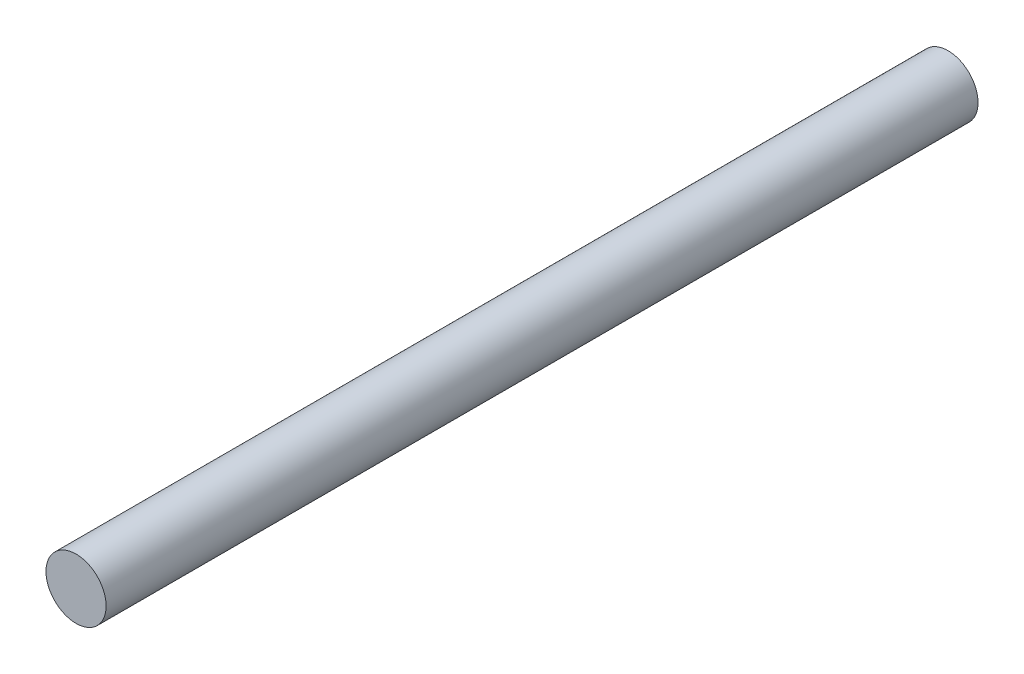
ISO-10303-21;
HEADER;
FILE_DESCRIPTION(('STEP AP214'),'2;1');
FILE_NAME('part.step','',(''),(''),'','','');
FILE_SCHEMA(('AUTOMOTIVE_DESIGN { 1 0 10303 214 1 1 1 1 }'));
ENDSEC;
DATA;
#1=APPLICATION_CONTEXT('core data for automotive mechanical design processes');
#2=APPLICATION_PROTOCOL_DEFINITION('international standard','automotive_design',2000,#1);
#3=PRODUCT_CONTEXT('',#1,'mechanical');
#4=PRODUCT('Part','Part','',(#3));
#5=PRODUCT_RELATED_PRODUCT_CATEGORY('part','',(#4));
#6=PRODUCT_DEFINITION_FORMATION('','',#4);
#7=PRODUCT_DEFINITION_CONTEXT('part definition',#1,'design');
#8=PRODUCT_DEFINITION('design','',#6,#7);
#9=PRODUCT_DEFINITION_SHAPE('','',#8);
#10=(LENGTH_UNIT() NAMED_UNIT(*) SI_UNIT(.MILLI.,.METRE.));
#11=(NAMED_UNIT(*) PLANE_ANGLE_UNIT() SI_UNIT($,.RADIAN.));
#12=(NAMED_UNIT(*) SI_UNIT($,.STERADIAN.) SOLID_ANGLE_UNIT());
#13=UNCERTAINTY_MEASURE_WITH_UNIT(LENGTH_MEASURE(1.E-05),#10,'distance_accuracy_value','');
#14=(GEOMETRIC_REPRESENTATION_CONTEXT(3) GLOBAL_UNCERTAINTY_ASSIGNED_CONTEXT((#13)) GLOBAL_UNIT_ASSIGNED_CONTEXT((#10,
#11,#12)) REPRESENTATION_CONTEXT('',''));
#15=CARTESIAN_POINT('',(0.,0.,0.));
#16=DIRECTION('',(0.,0.,1.));
#17=DIRECTION('',(1.,0.,0.));
#18=AXIS2_PLACEMENT_3D('',#15,#16,#17);
#19=CARTESIAN_POINT('',(0.,0.,58.));
#20=DIRECTION('',(0.,0.,-1.));
#21=DIRECTION('',(-1.,0.,0.));
#22=AXIS2_PLACEMENT_3D('',#19,#20,#21);
#23=CYLINDRICAL_SURFACE('',#22,2.);
#24=CARTESIAN_POINT('',(0.,0.,58.));
#25=DIRECTION('',(0.,0.,1.));
#26=DIRECTION('',(1.,0.,0.));
#27=AXIS2_PLACEMENT_3D('',#24,#25,#26);
#28=CIRCLE('',#27,2.);
#29=CARTESIAN_POINT('',(-2.,0.,58.));
#30=VERTEX_POINT('',#29);
#31=EDGE_CURVE('E10',#30,#30,#28,.T.);
#32=CARTESIAN_POINT('',(0.,0.,0.));
#33=DIRECTION('',(0.,0.,1.));
#34=DIRECTION('',(1.,0.,0.));
#35=AXIS2_PLACEMENT_3D('',#32,#33,#34);
#36=CIRCLE('',#35,2.);
#37=CARTESIAN_POINT('',(-2.,0.,0.));
#38=VERTEX_POINT('',#37);
#39=EDGE_CURVE('E40',#38,#38,#36,.T.);
#40=CARTESIAN_POINT('',(-2.,0.,58.));
#41=CARTESIAN_POINT('',(-2.,0.,57.3958333333333));
#42=CARTESIAN_POINT('',(-2.,0.,56.7916666666667));
#43=CARTESIAN_POINT('',(-2.,0.,55.5833333333333));
#44=CARTESIAN_POINT('',(-2.,0.,54.9791666666667));
#45=CARTESIAN_POINT('',(-2.,0.,53.7708333333333));
#46=CARTESIAN_POINT('',(-2.,0.,53.1666666666667));
#47=CARTESIAN_POINT('',(-2.,0.,51.9583333333333));
#48=CARTESIAN_POINT('',(-2.,0.,51.3541666666667));
#49=CARTESIAN_POINT('',(-2.,0.,50.1458333333333));
#50=CARTESIAN_POINT('',(-2.,0.,49.5416666666667));
#51=CARTESIAN_POINT('',(-2.,0.,48.3333333333333));
#52=CARTESIAN_POINT('',(-2.,0.,47.7291666666667));
#53=CARTESIAN_POINT('',(-2.,0.,46.5208333333333));
#54=CARTESIAN_POINT('',(-2.,0.,45.9166666666667));
#55=CARTESIAN_POINT('',(-2.,0.,44.7083333333333));
#56=CARTESIAN_POINT('',(-2.,0.,44.1041666666667));
#57=CARTESIAN_POINT('',(-2.,0.,42.8958333333333));
#58=CARTESIAN_POINT('',(-2.,0.,42.2916666666667));
#59=CARTESIAN_POINT('',(-2.,0.,41.0833333333333));
#60=CARTESIAN_POINT('',(-2.,0.,40.4791666666667));
#61=CARTESIAN_POINT('',(-2.,0.,39.2708333333333));
#62=CARTESIAN_POINT('',(-2.,0.,38.6666666666667));
#63=CARTESIAN_POINT('',(-2.,0.,37.4583333333333));
#64=CARTESIAN_POINT('',(-2.,0.,36.8541666666667));
#65=CARTESIAN_POINT('',(-2.,0.,35.6458333333333));
#66=CARTESIAN_POINT('',(-2.,0.,35.0416666666667));
#67=CARTESIAN_POINT('',(-2.,0.,33.8333333333333));
#68=CARTESIAN_POINT('',(-2.,0.,33.2291666666667));
#69=CARTESIAN_POINT('',(-2.,0.,32.0208333333333));
#70=CARTESIAN_POINT('',(-2.,0.,31.4166666666667));
#71=CARTESIAN_POINT('',(-2.,0.,30.2083333333333));
#72=CARTESIAN_POINT('',(-2.,0.,29.6041666666667));
#73=CARTESIAN_POINT('',(-2.,0.,28.3958333333333));
#74=CARTESIAN_POINT('',(-2.,0.,27.7916666666667));
#75=CARTESIAN_POINT('',(-2.,0.,26.5833333333333));
#76=CARTESIAN_POINT('',(-2.,0.,25.9791666666667));
#77=CARTESIAN_POINT('',(-2.,0.,24.7708333333333));
#78=CARTESIAN_POINT('',(-2.,0.,24.1666666666667));
#79=CARTESIAN_POINT('',(-2.,0.,22.9583333333333));
#80=CARTESIAN_POINT('',(-2.,0.,22.3541666666667));
#81=CARTESIAN_POINT('',(-2.,0.,21.1458333333333));
#82=CARTESIAN_POINT('',(-2.,0.,20.5416666666667));
#83=CARTESIAN_POINT('',(-2.,0.,19.3333333333333));
#84=CARTESIAN_POINT('',(-2.,0.,18.7291666666667));
#85=CARTESIAN_POINT('',(-2.,0.,17.5208333333333));
#86=CARTESIAN_POINT('',(-2.,0.,16.9166666666667));
#87=CARTESIAN_POINT('',(-2.,0.,15.7083333333333));
#88=CARTESIAN_POINT('',(-2.,0.,15.1041666666667));
#89=CARTESIAN_POINT('',(-2.,0.,13.8958333333333));
#90=CARTESIAN_POINT('',(-2.,0.,13.2916666666667));
#91=CARTESIAN_POINT('',(-2.,0.,12.0833333333333));
#92=CARTESIAN_POINT('',(-2.,0.,11.4791666666667));
#93=CARTESIAN_POINT('',(-2.,0.,10.2708333333333));
#94=CARTESIAN_POINT('',(-2.,0.,9.66666666666667));
#95=CARTESIAN_POINT('',(-2.,0.,8.45833333333333));
#96=CARTESIAN_POINT('',(-2.,0.,7.85416666666667));
#97=CARTESIAN_POINT('',(-2.,0.,6.64583333333333));
#98=CARTESIAN_POINT('',(-2.,0.,6.04166666666667));
#99=CARTESIAN_POINT('',(-2.,0.,4.83333333333333));
#100=CARTESIAN_POINT('',(-2.,0.,4.22916666666667));
#101=CARTESIAN_POINT('',(-2.,0.,3.02083333333334));
#102=CARTESIAN_POINT('',(-2.,0.,2.41666666666667));
#103=CARTESIAN_POINT('',(-2.,0.,1.20833333333333));
#104=CARTESIAN_POINT('',(-2.,0.,0.604166666666666));
#105=CARTESIAN_POINT('',(-2.,0.,0.));
#106=B_SPLINE_CURVE_WITH_KNOTS('',3,(#40,#41,#42,#43,#44,#45,#46,#47,#48,#49,#50,#51,#52,#53,
#54,#55,#56,#57,#58,#59,#60,#61,#62,#63,#64,#65,#66,#67,#68,#69,#70,#71,#72,#73,#74,#75,#76,#77,
#78,#79,#80,#81,#82,#83,#84,#85,#86,#87,#88,#89,#90,#91,#92,#93,#94,#95,#96,#97,#98,#99,#100,
#101,#102,#103,#104,#105),.UNSPECIFIED.,.F.,.F.,(4,2,2,2,2,2,2,2,2,2,2,2,2,2,2,2,2,2,2,2,2,2,2,
2,2,2,2,2,2,2,2,2,4),(0.,1.81249999999999,3.625,5.4375,7.24999999999999,9.06249999999999,10.875,
12.6875,14.5,16.3125,18.125,19.9375,21.75,23.5625,25.375,27.1875,29.,30.8125,32.625,34.4375,
36.25,38.0625,39.875,41.6875,43.5,45.3125,47.125,48.9375,50.75,52.5625,54.375,56.1875,58.),.UNSPECIFIED.);
#107=EDGE_CURVE('BSEAM37',#30,#38,#106,.T.);
#108=ORIENTED_EDGE('',*,*,#31,.F.);
#109=ORIENTED_EDGE('',*,*,#39,.T.);
#110=ORIENTED_EDGE('',*,*,#107,.T.);
#111=ORIENTED_EDGE('',*,*,#107,.F.);
#112=EDGE_LOOP('',(#108,#110,#109,#111));
#113=FACE_BOUND('',#112,.T.);
#114=ADVANCED_FACE('F37',(#113),#23,.T.);
#115=CARTESIAN_POINT('',(0.,0.,58.));
#116=DIRECTION('',(0.,0.,1.));
#117=DIRECTION('',(1.,0.,0.));
#118=AXIS2_PLACEMENT_3D('',#115,#116,#117);
#119=PLANE('',#118);
#120=ORIENTED_EDGE('',*,*,#31,.T.);
#121=EDGE_LOOP('',(#120));
#122=FACE_BOUND('',#121,.T.);
#123=ADVANCED_FACE('F70',(#122),#119,.T.);
#124=CARTESIAN_POINT('',(0.,0.,0.));
#125=DIRECTION('',(0.,0.,1.));
#126=DIRECTION('',(1.,0.,0.));
#127=AXIS2_PLACEMENT_3D('',#124,#125,#126);
#128=PLANE('',#127);
#129=CARTESIAN_POINT('',(0.,0.,0.));
#130=DIRECTION('',(0.,0.,-1.));
#131=DIRECTION('',(-1.,0.,0.));
#132=AXIS2_PLACEMENT_3D('',#129,#130,#131);
#133=CIRCLE('',#132,1.75);
#134=CARTESIAN_POINT('',(-1.75,0.,0.));
#135=VERTEX_POINT('',#134);
#136=EDGE_CURVE('E51',#135,#135,#133,.T.);
#137=ORIENTED_EDGE('',*,*,#136,.F.);
#138=EDGE_LOOP('',(#137));
#139=FACE_BOUND('',#138,.T.);
#140=ORIENTED_EDGE('',*,*,#39,.F.);
#141=EDGE_LOOP('',(#140));
#142=FACE_BOUND('',#141,.T.);
#143=ADVANCED_FACE('F64',(#139,#142),#128,.F.);
#144=CARTESIAN_POINT('',(0.,0.,3.));
#145=DIRECTION('',(0.,0.,-1.));
#146=DIRECTION('',(-1.,0.,0.));
#147=AXIS2_PLACEMENT_3D('',#144,#145,#146);
#148=CYLINDRICAL_SURFACE('',#147,1.75);
#149=CARTESIAN_POINT('',(0.,0.,3.));
#150=DIRECTION('',(0.,0.,-1.));
#151=DIRECTION('',(-1.,0.,0.));
#152=AXIS2_PLACEMENT_3D('',#149,#150,#151);
#153=CIRCLE('',#152,1.75);
#154=CARTESIAN_POINT('',(-1.75,0.,3.));
#155=VERTEX_POINT('',#154);
#156=EDGE_CURVE('E49',#155,#155,#153,.T.);
#157=ORIENTED_EDGE('',*,*,#156,.F.);
#158=EDGE_LOOP('',(#157));
#159=FACE_BOUND('',#158,.T.);
#160=ORIENTED_EDGE('',*,*,#136,.T.);
#161=EDGE_LOOP('',(#160));
#162=FACE_BOUND('',#161,.T.);
#163=ADVANCED_FACE('F61',(#159,#162),#148,.F.);
#164=CARTESIAN_POINT('',(0.,0.,3.));
#165=DIRECTION('',(0.,0.,-1.));
#166=DIRECTION('',(-1.,0.,0.));
#167=AXIS2_PLACEMENT_3D('',#164,#165,#166);
#168=PLANE('',#167);
#169=ORIENTED_EDGE('',*,*,#156,.T.);
#170=EDGE_LOOP('',(#169));
#171=FACE_BOUND('',#170,.T.);
#172=ADVANCED_FACE('F59',(#171),#168,.T.);
#173=CLOSED_SHELL('',(#114,#123,#143,#163,#172));
#174=MANIFOLD_SOLID_BREP('B2',#173);
#175=ADVANCED_BREP_SHAPE_REPRESENTATION('',(#18,#174),#14);
#176=SHAPE_DEFINITION_REPRESENTATION(#9,#175);
ENDSEC;
END-ISO-10303-21;
